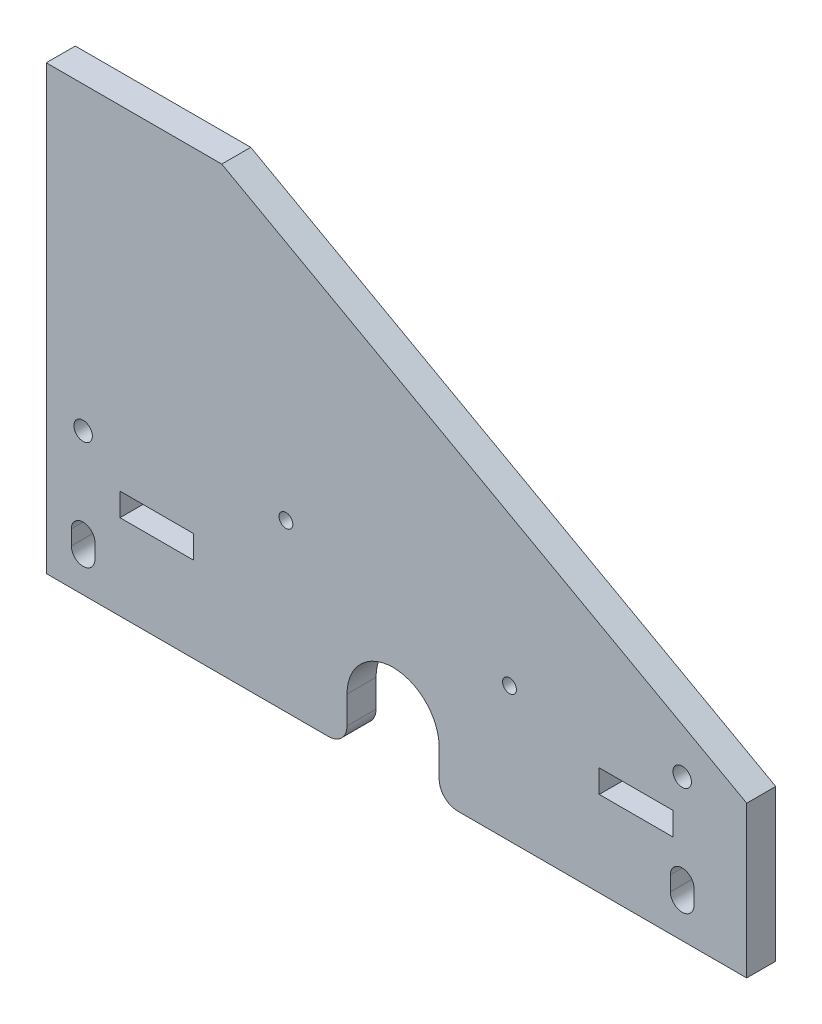
ISO-10303-21;
HEADER;
FILE_DESCRIPTION(('STEP AP214'),'2;1');
FILE_NAME('part.step','',(''),(''),'','','');
FILE_SCHEMA(('AUTOMOTIVE_DESIGN { 1 0 10303 214 1 1 1 1 }'));
ENDSEC;
DATA;
#1=APPLICATION_CONTEXT('core data for automotive mechanical design processes');
#2=APPLICATION_PROTOCOL_DEFINITION('international standard','automotive_design',2000,#1);
#3=PRODUCT_CONTEXT('',#1,'mechanical');
#4=PRODUCT('Part','Part','',(#3));
#5=PRODUCT_RELATED_PRODUCT_CATEGORY('part','',(#4));
#6=PRODUCT_DEFINITION_FORMATION('','',#4);
#7=PRODUCT_DEFINITION_CONTEXT('part definition',#1,'design');
#8=PRODUCT_DEFINITION('design','',#6,#7);
#9=PRODUCT_DEFINITION_SHAPE('','',#8);
#10=(LENGTH_UNIT() NAMED_UNIT(*) SI_UNIT(.MILLI.,.METRE.));
#11=(NAMED_UNIT(*) PLANE_ANGLE_UNIT() SI_UNIT($,.RADIAN.));
#12=(NAMED_UNIT(*) SI_UNIT($,.STERADIAN.) SOLID_ANGLE_UNIT());
#13=UNCERTAINTY_MEASURE_WITH_UNIT(LENGTH_MEASURE(1.E-05),#10,'distance_accuracy_value','');
#14=(GEOMETRIC_REPRESENTATION_CONTEXT(3) GLOBAL_UNCERTAINTY_ASSIGNED_CONTEXT((#13)) GLOBAL_UNIT_ASSIGNED_CONTEXT((#10,
#11,#12)) REPRESENTATION_CONTEXT('',''));
#15=CARTESIAN_POINT('',(0.,0.,0.));
#16=DIRECTION('',(0.,0.,1.));
#17=DIRECTION('',(1.,0.,0.));
#18=AXIS2_PLACEMENT_3D('',#15,#16,#17);
#19=CARTESIAN_POINT('',(-202.37863207058,-24.581916587002,10.));
#20=DIRECTION('',(0.,1.,0.));
#21=DIRECTION('',(0.,0.,1.));
#22=AXIS2_PLACEMENT_3D('',#19,#20,#21);
#23=PLANE('',#22);
#24=DIRECTION('',(0.,0.,1.));
#25=VECTOR('',#24,1.);
#26=CARTESIAN_POINT('',(-105.11949207058,-24.581916587002,0.));
#27=LINE('',#26,#25);
#28=CARTESIAN_POINT('',(-105.11949207058,-24.581916587002,0.));
#29=VERTEX_POINT('',#28);
#30=CARTESIAN_POINT('',(-105.11949207058,-24.581916587002,10.));
#31=VERTEX_POINT('',#30);
#32=EDGE_CURVE('E244',#29,#31,#27,.T.);
#33=ORIENTED_EDGE('',*,*,#32,.T.);
#34=DIRECTION('',(1.,0.,0.));
#35=VECTOR('',#34,1.);
#36=CARTESIAN_POINT('',(-202.37863207058,-24.581916587002,10.));
#37=LINE('',#36,#35);
#38=CARTESIAN_POINT('',(-202.37863207058,-24.581916587002,10.));
#39=VERTEX_POINT('',#38);
#40=EDGE_CURVE('E406',#39,#31,#37,.T.);
#41=ORIENTED_EDGE('',*,*,#40,.F.);
#42=DIRECTION('',(0.,0.,-1.));
#43=VECTOR('',#42,1.);
#44=CARTESIAN_POINT('',(-202.37863207058,-24.581916587002,10.));
#45=LINE('',#44,#43);
#46=CARTESIAN_POINT('',(-202.37863207058,-24.581916587002,0.));
#47=VERTEX_POINT('',#46);
#48=EDGE_CURVE('E423',#39,#47,#45,.T.);
#49=ORIENTED_EDGE('',*,*,#48,.T.);
#50=DIRECTION('',(1.,0.,0.));
#51=VECTOR('',#50,1.);
#52=CARTESIAN_POINT('',(-202.37863207058,-24.581916587002,0.));
#53=LINE('',#52,#51);
#54=EDGE_CURVE('E399',#47,#29,#53,.T.);
#55=ORIENTED_EDGE('',*,*,#54,.T.);
#56=EDGE_LOOP('',(#33,#41,#49,#55));
#57=FACE_BOUND('',#56,.T.);
#58=ADVANCED_FACE('F17',(#57),#23,.F.);
#59=CARTESIAN_POINT('',(38.92136792942,27.5724000758673,10.));
#60=DIRECTION('',(-1.,0.,0.));
#61=DIRECTION('',(0.,0.,1.));
#62=AXIS2_PLACEMENT_3D('',#59,#60,#61);
#63=PLANE('',#62);
#64=DIRECTION('',(0.,1.,0.));
#65=VECTOR('',#64,1.);
#66=CARTESIAN_POINT('',(38.92136792942,27.5724000758673,0.));
#67=LINE('',#66,#65);
#68=CARTESIAN_POINT('',(38.92136792942,-24.581916587002,0.));
#69=VERTEX_POINT('',#68);
#70=CARTESIAN_POINT('',(38.92136792942,27.5724000758673,0.));
#71=VERTEX_POINT('',#70);
#72=EDGE_CURVE('E394',#69,#71,#67,.T.);
#73=ORIENTED_EDGE('',*,*,#72,.T.);
#74=DIRECTION('',(0.,0.,-1.));
#75=VECTOR('',#74,1.);
#76=CARTESIAN_POINT('',(38.92136792942,27.5724000758673,10.));
#77=LINE('',#76,#75);
#78=CARTESIAN_POINT('',(38.92136792942,27.5724000758673,10.));
#79=VERTEX_POINT('',#78);
#80=EDGE_CURVE('E11',#79,#71,#77,.T.);
#81=ORIENTED_EDGE('',*,*,#80,.F.);
#82=DIRECTION('',(0.,1.,0.));
#83=VECTOR('',#82,1.);
#84=CARTESIAN_POINT('',(38.92136792942,27.5724000758673,10.));
#85=LINE('',#84,#83);
#86=CARTESIAN_POINT('',(38.92136792942,-24.581916587002,10.));
#87=VERTEX_POINT('',#86);
#88=EDGE_CURVE('E395',#87,#79,#85,.T.);
#89=ORIENTED_EDGE('',*,*,#88,.F.);
#90=DIRECTION('',(0.,0.,-1.));
#91=VECTOR('',#90,1.);
#92=CARTESIAN_POINT('',(38.92136792942,-24.581916587002,10.));
#93=LINE('',#92,#91);
#94=EDGE_CURVE('E409',#87,#69,#93,.T.);
#95=ORIENTED_EDGE('',*,*,#94,.T.);
#96=EDGE_LOOP('',(#73,#81,#89,#95));
#97=FACE_BOUND('',#96,.T.);
#98=ADVANCED_FACE('F19',(#97),#63,.F.);
#99=CARTESIAN_POINT('',(-141.92663207058,127.818083412998,10.));
#100=DIRECTION('',(-0.484809620246338,-0.874619707139395,0.));
#101=DIRECTION('',(0.874619707139395,-0.484809620246338,0.));
#102=AXIS2_PLACEMENT_3D('',#99,#100,#101);
#103=PLANE('',#102);
#104=DIRECTION('',(-0.874619707139395,0.484809620246338,0.));
#105=VECTOR('',#104,1.);
#106=CARTESIAN_POINT('',(-141.92663207058,127.818083412998,0.));
#107=LINE('',#106,#105);
#108=CARTESIAN_POINT('',(-141.92663207058,127.818083412998,0.));
#109=VERTEX_POINT('',#108);
#110=EDGE_CURVE('E412',#71,#109,#107,.T.);
#111=ORIENTED_EDGE('',*,*,#110,.T.);
#112=DIRECTION('',(0.,0.,-1.));
#113=VECTOR('',#112,1.);
#114=CARTESIAN_POINT('',(-141.92663207058,127.818083412998,10.));
#115=LINE('',#114,#113);
#116=CARTESIAN_POINT('',(-141.92663207058,127.818083412998,10.));
#117=VERTEX_POINT('',#116);
#118=EDGE_CURVE('E25',#117,#109,#115,.T.);
#119=ORIENTED_EDGE('',*,*,#118,.F.);
#120=DIRECTION('',(-0.874619707139395,0.484809620246338,0.));
#121=VECTOR('',#120,1.);
#122=CARTESIAN_POINT('',(-141.92663207058,127.818083412998,10.));
#123=LINE('',#122,#121);
#124=EDGE_CURVE('E398',#79,#117,#123,.T.);
#125=ORIENTED_EDGE('',*,*,#124,.F.);
#126=ORIENTED_EDGE('',*,*,#80,.T.);
#127=EDGE_LOOP('',(#111,#119,#125,#126));
#128=FACE_BOUND('',#127,.T.);
#129=ADVANCED_FACE('F452',(#128),#103,.F.);
#130=CARTESIAN_POINT('',(-202.37863207058,127.818083412998,10.));
#131=DIRECTION('',(0.,-1.,0.));
#132=DIRECTION('',(0.,0.,-1.));
#133=AXIS2_PLACEMENT_3D('',#130,#131,#132);
#134=PLANE('',#133);
#135=DIRECTION('',(-1.,0.,0.));
#136=VECTOR('',#135,1.);
#137=CARTESIAN_POINT('',(-202.37863207058,127.818083412998,0.));
#138=LINE('',#137,#136);
#139=CARTESIAN_POINT('',(-202.37863207058,127.818083412998,0.));
#140=VERTEX_POINT('',#139);
#141=EDGE_CURVE('E414',#109,#140,#138,.T.);
#142=ORIENTED_EDGE('',*,*,#141,.T.);
#143=DIRECTION('',(0.,0.,-1.));
#144=VECTOR('',#143,1.);
#145=CARTESIAN_POINT('',(-202.37863207058,127.818083412998,10.));
#146=LINE('',#145,#144);
#147=CARTESIAN_POINT('',(-202.37863207058,127.818083412998,10.));
#148=VERTEX_POINT('',#147);
#149=EDGE_CURVE('E426',#148,#140,#146,.T.);
#150=ORIENTED_EDGE('',*,*,#149,.F.);
#151=DIRECTION('',(-1.,0.,0.));
#152=VECTOR('',#151,1.);
#153=CARTESIAN_POINT('',(-202.37863207058,127.818083412998,10.));
#154=LINE('',#153,#152);
#155=EDGE_CURVE('E401',#117,#148,#154,.T.);
#156=ORIENTED_EDGE('',*,*,#155,.F.);
#157=ORIENTED_EDGE('',*,*,#118,.T.);
#158=EDGE_LOOP('',(#142,#150,#156,#157));
#159=FACE_BOUND('',#158,.T.);
#160=ADVANCED_FACE('F433',(#159),#134,.F.);
#161=CARTESIAN_POINT('',(-202.37863207058,127.818083412998,10.));
#162=DIRECTION('',(1.,0.,0.));
#163=DIRECTION('',(0.,1.,0.));
#164=AXIS2_PLACEMENT_3D('',#161,#162,#163);
#165=PLANE('',#164);
#166=DIRECTION('',(0.,-1.,0.));
#167=VECTOR('',#166,1.);
#168=CARTESIAN_POINT('',(-202.37863207058,127.818083412998,0.));
#169=LINE('',#168,#167);
#170=EDGE_CURVE('E416',#140,#47,#169,.T.);
#171=ORIENTED_EDGE('',*,*,#170,.T.);
#172=ORIENTED_EDGE('',*,*,#48,.F.);
#173=DIRECTION('',(0.,-1.,0.));
#174=VECTOR('',#173,1.);
#175=CARTESIAN_POINT('',(-202.37863207058,127.818083412998,10.));
#176=LINE('',#175,#174);
#177=EDGE_CURVE('E403',#148,#39,#176,.T.);
#178=ORIENTED_EDGE('',*,*,#177,.F.);
#179=ORIENTED_EDGE('',*,*,#149,.T.);
#180=EDGE_LOOP('',(#171,#172,#178,#179));
#181=FACE_BOUND('',#180,.T.);
#182=ADVANCED_FACE('F441',(#181),#165,.F.);
#183=CARTESIAN_POINT('',(-60.6694920705801,-24.581916587002,10.));
#184=VERTEX_POINT('',#183);
#185=EDGE_CURVE('E405',#184,#87,#37,.T.);
#186=ORIENTED_EDGE('',*,*,#185,.F.);
#187=DIRECTION('',(0.,0.,1.));
#188=VECTOR('',#187,1.);
#189=CARTESIAN_POINT('',(-60.6694920705801,-24.581916587002,0.));
#190=LINE('',#189,#188);
#191=CARTESIAN_POINT('',(-60.6694920705801,-24.581916587002,0.));
#192=VERTEX_POINT('',#191);
#193=EDGE_CURVE('E242',#192,#184,#190,.T.);
#194=ORIENTED_EDGE('',*,*,#193,.F.);
#195=EDGE_CURVE('E418',#192,#69,#53,.T.);
#196=ORIENTED_EDGE('',*,*,#195,.T.);
#197=ORIENTED_EDGE('',*,*,#94,.F.);
#198=EDGE_LOOP('',(#186,#194,#196,#197));
#199=FACE_BOUND('',#198,.T.);
#200=ADVANCED_FACE('F458',(#199),#23,.F.);
#201=CARTESIAN_POINT('',(38.9213679294199,-24.581916587002,10.));
#202=DIRECTION('',(0.,0.,1.));
#203=DIRECTION('',(1.,0.,0.));
#204=AXIS2_PLACEMENT_3D('',#201,#202,#203);
#205=PLANE('',#204);
#206=CARTESIAN_POINT('',(-60.6694920705801,-18.231916587002,10.));
#207=DIRECTION('',(0.,0.,-1.));
#208=DIRECTION('',(1.,0.,0.));
#209=AXIS2_PLACEMENT_3D('',#206,#207,#208);
#210=CIRCLE('',#209,6.35);
#211=CARTESIAN_POINT('',(-67.0194920705801,-18.231916587002,10.));
#212=VERTEX_POINT('',#211);
#213=EDGE_CURVE('E223',#184,#212,#210,.T.);
#214=ORIENTED_EDGE('',*,*,#213,.F.);
#215=ORIENTED_EDGE('',*,*,#185,.T.);
#216=ORIENTED_EDGE('',*,*,#88,.T.);
#217=ORIENTED_EDGE('',*,*,#124,.T.);
#218=ORIENTED_EDGE('',*,*,#155,.T.);
#219=ORIENTED_EDGE('',*,*,#177,.T.);
#220=ORIENTED_EDGE('',*,*,#40,.T.);
#221=CARTESIAN_POINT('',(-105.11949207058,-18.231916587002,10.));
#222=DIRECTION('',(0.,0.,-1.));
#223=DIRECTION('',(1.,0.,0.));
#224=AXIS2_PLACEMENT_3D('',#221,#222,#223);
#225=CIRCLE('',#224,6.35);
#226=CARTESIAN_POINT('',(-98.7694920705801,-18.231916587002,10.));
#227=VERTEX_POINT('',#226);
#228=EDGE_CURVE('E233',#227,#31,#225,.T.);
#229=ORIENTED_EDGE('',*,*,#228,.F.);
#230=DIRECTION('',(0.,-1.,0.));
#231=VECTOR('',#230,1.);
#232=CARTESIAN_POINT('',(-98.7694920705801,-8.70691658700201,10.));
#233=LINE('',#232,#231);
#234=CARTESIAN_POINT('',(-98.7694920705801,-8.70691658700201,10.));
#235=VERTEX_POINT('',#234);
#236=EDGE_CURVE('E231',#235,#227,#233,.T.);
#237=ORIENTED_EDGE('',*,*,#236,.F.);
#238=CARTESIAN_POINT('',(-82.8944920705801,-8.70691658700201,10.));
#239=DIRECTION('',(0.,0.,1.));
#240=DIRECTION('',(1.,0.,0.));
#241=AXIS2_PLACEMENT_3D('',#238,#239,#240);
#242=CIRCLE('',#241,15.875);
#243=CARTESIAN_POINT('',(-67.0194920705801,-8.70691658700201,10.));
#244=VERTEX_POINT('',#243);
#245=EDGE_CURVE('E203',#244,#235,#242,.T.);
#246=ORIENTED_EDGE('',*,*,#245,.F.);
#247=DIRECTION('',(0.,1.,0.));
#248=VECTOR('',#247,1.);
#249=CARTESIAN_POINT('',(-67.0194920705801,-8.70691658700201,10.));
#250=LINE('',#249,#248);
#251=EDGE_CURVE('E220',#212,#244,#250,.T.);
#252=ORIENTED_EDGE('',*,*,#251,.F.);
#253=EDGE_LOOP('',(#214,#215,#216,#217,#218,#219,#220,#229,#237,#246,#252));
#254=FACE_BOUND('',#253,.T.);
#255=CARTESIAN_POINT('',(16.6963679294199,24.358803412998,10.));
#256=DIRECTION('',(0.,0.,1.));
#257=DIRECTION('',(1.,0.,0.));
#258=AXIS2_PLACEMENT_3D('',#255,#256,#257);
#259=CIRCLE('',#258,3.175);
#260=CARTESIAN_POINT('',(19.8713679294199,24.358803412998,10.));
#261=VERTEX_POINT('',#260);
#262=EDGE_CURVE('E239',#261,#261,#259,.T.);
#263=ORIENTED_EDGE('',*,*,#262,.F.);
#264=EDGE_LOOP('',(#263));
#265=FACE_BOUND('',#264,.T.);
#266=CARTESIAN_POINT('',(16.6963679294199,-12.008916587002,10.));
#267=DIRECTION('',(0.,0.,1.));
#268=DIRECTION('',(1.,0.,0.));
#269=AXIS2_PLACEMENT_3D('',#266,#267,#268);
#270=CIRCLE('',#269,4.064);
#271=CARTESIAN_POINT('',(12.6323679294199,-12.008916587002,10.));
#272=VERTEX_POINT('',#271);
#273=CARTESIAN_POINT('',(20.76036792942,-12.008916587002,10.));
#274=VERTEX_POINT('',#273);
#275=EDGE_CURVE('E40',#272,#274,#270,.T.);
#276=ORIENTED_EDGE('',*,*,#275,.F.);
#277=DIRECTION('',(0.,-1.,0.));
#278=VECTOR('',#277,1.);
#279=CARTESIAN_POINT('',(12.6323679294199,-12.008916587002,10.));
#280=LINE('',#279,#278);
#281=CARTESIAN_POINT('',(12.6323679294199,-6.92891658700202,10.));
#282=VERTEX_POINT('',#281);
#283=EDGE_CURVE('E268',#282,#272,#280,.T.);
#284=ORIENTED_EDGE('',*,*,#283,.F.);
#285=CARTESIAN_POINT('',(16.6963679294199,-6.92891658700202,10.));
#286=DIRECTION('',(0.,0.,1.));
#287=DIRECTION('',(1.,0.,0.));
#288=AXIS2_PLACEMENT_3D('',#285,#286,#287);
#289=CIRCLE('',#288,4.064);
#290=CARTESIAN_POINT('',(20.76036792942,-6.92891658700202,10.));
#291=VERTEX_POINT('',#290);
#292=EDGE_CURVE('E265',#291,#282,#289,.T.);
#293=ORIENTED_EDGE('',*,*,#292,.F.);
#294=DIRECTION('',(0.,1.,0.));
#295=VECTOR('',#294,1.);
#296=CARTESIAN_POINT('',(20.76036792942,-6.92891658700202,10.));
#297=LINE('',#296,#295);
#298=EDGE_CURVE('E262',#274,#291,#297,.T.);
#299=ORIENTED_EDGE('',*,*,#298,.F.);
#300=EDGE_LOOP('',(#276,#284,#293,#299));
#301=FACE_BOUND('',#300,.T.);
#302=DIRECTION('',(0.,1.,0.));
#303=VECTOR('',#302,1.);
#304=CARTESIAN_POINT('',(13.5213679294199,12.725603412998,10.));
#305=LINE('',#304,#303);
#306=CARTESIAN_POINT('',(13.5213679294199,4.78810341299798,10.));
#307=VERTEX_POINT('',#306);
#308=CARTESIAN_POINT('',(13.5213679294199,12.725603412998,10.));
#309=VERTEX_POINT('',#308);
#310=EDGE_CURVE('E282',#307,#309,#305,.T.);
#311=ORIENTED_EDGE('',*,*,#310,.F.);
#312=DIRECTION('',(1.,0.,0.));
#313=VECTOR('',#312,1.);
#314=CARTESIAN_POINT('',(13.5213679294199,4.78810341299798,10.));
#315=LINE('',#314,#313);
#316=CARTESIAN_POINT('',(-11.87863207058,4.78810341299798,10.));
#317=VERTEX_POINT('',#316);
#318=EDGE_CURVE('E287',#317,#307,#315,.T.);
#319=ORIENTED_EDGE('',*,*,#318,.F.);
#320=DIRECTION('',(0.,-1.,0.));
#321=VECTOR('',#320,1.);
#322=CARTESIAN_POINT('',(-11.87863207058,12.725603412998,10.));
#323=LINE('',#322,#321);
#324=CARTESIAN_POINT('',(-11.87863207058,12.725603412998,10.));
#325=VERTEX_POINT('',#324);
#326=EDGE_CURVE('E301',#325,#317,#323,.T.);
#327=ORIENTED_EDGE('',*,*,#326,.F.);
#328=DIRECTION('',(-1.,0.,0.));
#329=VECTOR('',#328,1.);
#330=CARTESIAN_POINT('',(13.5213679294199,12.725603412998,10.));
#331=LINE('',#330,#329);
#332=EDGE_CURVE('E298',#309,#325,#331,.T.);
#333=ORIENTED_EDGE('',*,*,#332,.F.);
#334=EDGE_LOOP('',(#311,#319,#327,#333));
#335=FACE_BOUND('',#334,.T.);
#336=CARTESIAN_POINT('',(-42.7929720705801,21.773083412998,10.));
#337=DIRECTION('',(0.,0.,1.));
#338=DIRECTION('',(1.,0.,0.));
#339=AXIS2_PLACEMENT_3D('',#336,#337,#338);
#340=CIRCLE('',#339,2.38125);
#341=CARTESIAN_POINT('',(-40.4117220705801,21.773083412998,10.));
#342=VERTEX_POINT('',#341);
#343=EDGE_CURVE('E308',#342,#342,#340,.T.);
#344=ORIENTED_EDGE('',*,*,#343,.F.);
#345=EDGE_LOOP('',(#344));
#346=FACE_BOUND('',#345,.T.);
#347=CARTESIAN_POINT('',(-119.82863207058,32.568083412998,10.));
#348=DIRECTION('',(0.,0.,1.));
#349=DIRECTION('',(1.,0.,0.));
#350=AXIS2_PLACEMENT_3D('',#347,#348,#349);
#351=CIRCLE('',#350,2.38125);
#352=CARTESIAN_POINT('',(-117.44738207058,32.568083412998,10.));
#353=VERTEX_POINT('',#352);
#354=EDGE_CURVE('E318',#353,#353,#351,.T.);
#355=ORIENTED_EDGE('',*,*,#354,.F.);
#356=EDGE_LOOP('',(#355));
#357=FACE_BOUND('',#356,.T.);
#358=CARTESIAN_POINT('',(-189.67863207058,24.358803412998,10.));
#359=DIRECTION('',(0.,0.,1.));
#360=DIRECTION('',(1.,0.,0.));
#361=AXIS2_PLACEMENT_3D('',#358,#359,#360);
#362=CIRCLE('',#361,3.175);
#363=CARTESIAN_POINT('',(-186.50363207058,24.358803412998,10.));
#364=VERTEX_POINT('',#363);
#365=EDGE_CURVE('E324',#364,#364,#362,.T.);
#366=ORIENTED_EDGE('',*,*,#365,.F.);
#367=EDGE_LOOP('',(#366));
#368=FACE_BOUND('',#367,.T.);
#369=CARTESIAN_POINT('',(-189.67863207058,-12.008916587002,10.));
#370=DIRECTION('',(0.,0.,1.));
#371=DIRECTION('',(1.,0.,0.));
#372=AXIS2_PLACEMENT_3D('',#369,#370,#371);
#373=CIRCLE('',#372,4.064);
#374=CARTESIAN_POINT('',(-193.74263207058,-12.008916587002,10.));
#375=VERTEX_POINT('',#374);
#376=CARTESIAN_POINT('',(-185.61463207058,-12.008916587002,10.));
#377=VERTEX_POINT('',#376);
#378=EDGE_CURVE('E340',#375,#377,#373,.T.);
#379=ORIENTED_EDGE('',*,*,#378,.F.);
#380=DIRECTION('',(0.,-1.,0.));
#381=VECTOR('',#380,1.);
#382=CARTESIAN_POINT('',(-193.74263207058,-12.008916587002,10.));
#383=LINE('',#382,#381);
#384=CARTESIAN_POINT('',(-193.74263207058,-6.92891658700202,10.));
#385=VERTEX_POINT('',#384);
#386=EDGE_CURVE('E348',#385,#375,#383,.T.);
#387=ORIENTED_EDGE('',*,*,#386,.F.);
#388=CARTESIAN_POINT('',(-189.67863207058,-6.92891658700202,10.));
#389=DIRECTION('',(0.,0.,1.));
#390=DIRECTION('',(1.,0.,0.));
#391=AXIS2_PLACEMENT_3D('',#388,#389,#390);
#392=CIRCLE('',#391,4.064);
#393=CARTESIAN_POINT('',(-185.61463207058,-6.92891658700202,10.));
#394=VERTEX_POINT('',#393);
#395=EDGE_CURVE('E345',#394,#385,#392,.T.);
#396=ORIENTED_EDGE('',*,*,#395,.F.);
#397=DIRECTION('',(0.,1.,0.));
#398=VECTOR('',#397,1.);
#399=CARTESIAN_POINT('',(-185.61463207058,-6.92891658700202,10.));
#400=LINE('',#399,#398);
#401=EDGE_CURVE('E342',#377,#394,#400,.T.);
#402=ORIENTED_EDGE('',*,*,#401,.F.);
#403=EDGE_LOOP('',(#379,#387,#396,#402));
#404=FACE_BOUND('',#403,.T.);
#405=DIRECTION('',(0.,-1.,0.));
#406=VECTOR('',#405,1.);
#407=CARTESIAN_POINT('',(-176.97863207058,4.78810341299798,10.));
#408=LINE('',#407,#406);
#409=CARTESIAN_POINT('',(-176.97863207058,12.725603412998,10.));
#410=VERTEX_POINT('',#409);
#411=CARTESIAN_POINT('',(-176.97863207058,4.78810341299798,10.));
#412=VERTEX_POINT('',#411);
#413=EDGE_CURVE('E371',#410,#412,#408,.T.);
#414=ORIENTED_EDGE('',*,*,#413,.F.);
#415=DIRECTION('',(-1.,0.,0.));
#416=VECTOR('',#415,1.);
#417=CARTESIAN_POINT('',(-176.97863207058,12.725603412998,10.));
#418=LINE('',#417,#416);
#419=CARTESIAN_POINT('',(-151.57863207058,12.725603412998,10.));
#420=VERTEX_POINT('',#419);
#421=EDGE_CURVE('E379',#420,#410,#418,.T.);
#422=ORIENTED_EDGE('',*,*,#421,.F.);
#423=DIRECTION('',(0.,1.,0.));
#424=VECTOR('',#423,1.);
#425=CARTESIAN_POINT('',(-151.57863207058,4.78810341299798,10.));
#426=LINE('',#425,#424);
#427=CARTESIAN_POINT('',(-151.57863207058,4.78810341299798,10.));
#428=VERTEX_POINT('',#427);
#429=EDGE_CURVE('E376',#428,#420,#426,.T.);
#430=ORIENTED_EDGE('',*,*,#429,.F.);
#431=DIRECTION('',(1.,0.,0.));
#432=VECTOR('',#431,1.);
#433=CARTESIAN_POINT('',(-176.97863207058,4.78810341299798,10.));
#434=LINE('',#433,#432);
#435=EDGE_CURVE('E373',#412,#428,#434,.T.);
#436=ORIENTED_EDGE('',*,*,#435,.F.);
#437=EDGE_LOOP('',(#414,#422,#430,#436));
#438=FACE_BOUND('',#437,.T.);
#439=ADVANCED_FACE('F448',(#254,#265,#301,#335,#346,#357,#368,#404,#438),#205,.T.);
#440=CARTESIAN_POINT('',(38.9213679294199,-24.581916587002,0.));
#441=DIRECTION('',(0.,0.,1.));
#442=DIRECTION('',(1.,0.,0.));
#443=AXIS2_PLACEMENT_3D('',#440,#441,#442);
#444=PLANE('',#443);
#445=ORIENTED_EDGE('',*,*,#195,.F.);
#446=CARTESIAN_POINT('',(-60.6694920705801,-18.231916587002,0.));
#447=DIRECTION('',(0.,0.,-1.));
#448=DIRECTION('',(1.,0.,0.));
#449=AXIS2_PLACEMENT_3D('',#446,#447,#448);
#450=CIRCLE('',#449,6.35);
#451=CARTESIAN_POINT('',(-67.0194920705801,-18.231916587002,0.));
#452=VERTEX_POINT('',#451);
#453=EDGE_CURVE('E227',#192,#452,#450,.T.);
#454=ORIENTED_EDGE('',*,*,#453,.T.);
#455=DIRECTION('',(0.,1.,0.));
#456=VECTOR('',#455,1.);
#457=CARTESIAN_POINT('',(-67.0194920705801,-8.70691658700201,0.));
#458=LINE('',#457,#456);
#459=CARTESIAN_POINT('',(-67.0194920705801,-8.70691658700201,0.));
#460=VERTEX_POINT('',#459);
#461=EDGE_CURVE('E208',#452,#460,#458,.T.);
#462=ORIENTED_EDGE('',*,*,#461,.T.);
#463=CARTESIAN_POINT('',(-82.8944920705801,-8.70691658700201,0.));
#464=DIRECTION('',(0.,0.,1.));
#465=DIRECTION('',(1.,0.,0.));
#466=AXIS2_PLACEMENT_3D('',#463,#464,#465);
#467=CIRCLE('',#466,15.875);
#468=CARTESIAN_POINT('',(-98.7694920705801,-8.70691658700201,0.));
#469=VERTEX_POINT('',#468);
#470=EDGE_CURVE('E200',#460,#469,#467,.T.);
#471=ORIENTED_EDGE('',*,*,#470,.T.);
#472=DIRECTION('',(0.,-1.,0.));
#473=VECTOR('',#472,1.);
#474=CARTESIAN_POINT('',(-98.7694920705801,-8.70691658700201,0.));
#475=LINE('',#474,#473);
#476=CARTESIAN_POINT('',(-98.7694920705801,-18.231916587002,0.));
#477=VERTEX_POINT('',#476);
#478=EDGE_CURVE('E211',#469,#477,#475,.T.);
#479=ORIENTED_EDGE('',*,*,#478,.T.);
#480=CARTESIAN_POINT('',(-105.11949207058,-18.231916587002,0.));
#481=DIRECTION('',(0.,0.,-1.));
#482=DIRECTION('',(1.,0.,0.));
#483=AXIS2_PLACEMENT_3D('',#480,#481,#482);
#484=CIRCLE('',#483,6.35);
#485=EDGE_CURVE('E32',#477,#29,#484,.T.);
#486=ORIENTED_EDGE('',*,*,#485,.T.);
#487=ORIENTED_EDGE('',*,*,#54,.F.);
#488=ORIENTED_EDGE('',*,*,#170,.F.);
#489=ORIENTED_EDGE('',*,*,#141,.F.);
#490=ORIENTED_EDGE('',*,*,#110,.F.);
#491=ORIENTED_EDGE('',*,*,#72,.F.);
#492=EDGE_LOOP('',(#445,#454,#462,#471,#479,#486,#487,#488,#489,#490,#491));
#493=FACE_BOUND('',#492,.T.);
#494=CARTESIAN_POINT('',(16.6963679294199,24.358803412998,0.));
#495=DIRECTION('',(0.,0.,1.));
#496=DIRECTION('',(1.,0.,0.));
#497=AXIS2_PLACEMENT_3D('',#494,#495,#496);
#498=CIRCLE('',#497,3.175);
#499=CARTESIAN_POINT('',(19.8713679294199,24.358803412998,0.));
#500=VERTEX_POINT('',#499);
#501=EDGE_CURVE('E248',#500,#500,#498,.T.);
#502=ORIENTED_EDGE('',*,*,#501,.T.);
#503=EDGE_LOOP('',(#502));
#504=FACE_BOUND('',#503,.T.);
#505=DIRECTION('',(0.,1.,0.));
#506=VECTOR('',#505,1.);
#507=CARTESIAN_POINT('',(12.6323679294199,-12.008916587002,0.));
#508=LINE('',#507,#506);
#509=CARTESIAN_POINT('',(12.6323679294199,-12.008916587002,0.));
#510=VERTEX_POINT('',#509);
#511=CARTESIAN_POINT('',(12.6323679294199,-6.92891658700202,0.));
#512=VERTEX_POINT('',#511);
#513=EDGE_CURVE('E255',#510,#512,#508,.T.);
#514=ORIENTED_EDGE('',*,*,#513,.F.);
#515=CARTESIAN_POINT('',(16.6963679294199,-12.008916587002,0.));
#516=DIRECTION('',(0.,0.,1.));
#517=DIRECTION('',(1.,0.,0.));
#518=AXIS2_PLACEMENT_3D('',#515,#516,#517);
#519=CIRCLE('',#518,4.064);
#520=CARTESIAN_POINT('',(20.76036792942,-12.008916587002,0.));
#521=VERTEX_POINT('',#520);
#522=EDGE_CURVE('E258',#521,#510,#519,.F.);
#523=ORIENTED_EDGE('',*,*,#522,.F.);
#524=DIRECTION('',(0.,-1.,0.));
#525=VECTOR('',#524,1.);
#526=CARTESIAN_POINT('',(20.76036792942,-6.92891658700202,0.));
#527=LINE('',#526,#525);
#528=CARTESIAN_POINT('',(20.76036792942,-6.92891658700202,0.));
#529=VERTEX_POINT('',#528);
#530=EDGE_CURVE('E274',#529,#521,#527,.T.);
#531=ORIENTED_EDGE('',*,*,#530,.F.);
#532=CARTESIAN_POINT('',(16.6963679294199,-6.92891658700202,0.));
#533=DIRECTION('',(0.,0.,1.));
#534=DIRECTION('',(1.,0.,0.));
#535=AXIS2_PLACEMENT_3D('',#532,#533,#534);
#536=CIRCLE('',#535,4.064);
#537=EDGE_CURVE('E251',#512,#529,#536,.F.);
#538=ORIENTED_EDGE('',*,*,#537,.F.);
#539=EDGE_LOOP('',(#514,#523,#531,#538));
#540=FACE_BOUND('',#539,.T.);
#541=DIRECTION('',(1.,0.,0.));
#542=VECTOR('',#541,1.);
#543=CARTESIAN_POINT('',(13.5213679294199,4.78810341299798,0.));
#544=LINE('',#543,#542);
#545=CARTESIAN_POINT('',(-11.87863207058,4.78810341299798,0.));
#546=VERTEX_POINT('',#545);
#547=CARTESIAN_POINT('',(13.5213679294199,4.78810341299798,0.));
#548=VERTEX_POINT('',#547);
#549=EDGE_CURVE('E293',#546,#548,#544,.T.);
#550=ORIENTED_EDGE('',*,*,#549,.T.);
#551=DIRECTION('',(0.,1.,0.));
#552=VECTOR('',#551,1.);
#553=CARTESIAN_POINT('',(13.5213679294199,12.725603412998,0.));
#554=LINE('',#553,#552);
#555=CARTESIAN_POINT('',(13.5213679294199,12.725603412998,0.));
#556=VERTEX_POINT('',#555);
#557=EDGE_CURVE('E283',#548,#556,#554,.T.);
#558=ORIENTED_EDGE('',*,*,#557,.T.);
#559=DIRECTION('',(-1.,0.,0.));
#560=VECTOR('',#559,1.);
#561=CARTESIAN_POINT('',(13.5213679294199,12.725603412998,0.));
#562=LINE('',#561,#560);
#563=CARTESIAN_POINT('',(-11.87863207058,12.725603412998,0.));
#564=VERTEX_POINT('',#563);
#565=EDGE_CURVE('E286',#556,#564,#562,.T.);
#566=ORIENTED_EDGE('',*,*,#565,.T.);
#567=DIRECTION('',(0.,-1.,0.));
#568=VECTOR('',#567,1.);
#569=CARTESIAN_POINT('',(-11.87863207058,12.725603412998,0.));
#570=LINE('',#569,#568);
#571=EDGE_CURVE('E290',#564,#546,#570,.T.);
#572=ORIENTED_EDGE('',*,*,#571,.T.);
#573=EDGE_LOOP('',(#550,#558,#566,#572));
#574=FACE_BOUND('',#573,.T.);
#575=CARTESIAN_POINT('',(-42.7929720705801,21.773083412998,0.));
#576=DIRECTION('',(0.,0.,1.));
#577=DIRECTION('',(1.,0.,0.));
#578=AXIS2_PLACEMENT_3D('',#575,#576,#577);
#579=CIRCLE('',#578,2.38125);
#580=CARTESIAN_POINT('',(-40.4117220705801,21.773083412998,0.));
#581=VERTEX_POINT('',#580);
#582=EDGE_CURVE('E315',#581,#581,#579,.T.);
#583=ORIENTED_EDGE('',*,*,#582,.T.);
#584=EDGE_LOOP('',(#583));
#585=FACE_BOUND('',#584,.T.);
#586=CARTESIAN_POINT('',(-119.82863207058,32.568083412998,0.));
#587=DIRECTION('',(0.,0.,1.));
#588=DIRECTION('',(1.,0.,0.));
#589=AXIS2_PLACEMENT_3D('',#586,#587,#588);
#590=CIRCLE('',#589,2.38125);
#591=CARTESIAN_POINT('',(-117.44738207058,32.568083412998,0.));
#592=VERTEX_POINT('',#591);
#593=EDGE_CURVE('E321',#592,#592,#590,.T.);
#594=ORIENTED_EDGE('',*,*,#593,.T.);
#595=EDGE_LOOP('',(#594));
#596=FACE_BOUND('',#595,.T.);
#597=CARTESIAN_POINT('',(-189.67863207058,24.358803412998,0.));
#598=DIRECTION('',(0.,0.,1.));
#599=DIRECTION('',(1.,0.,0.));
#600=AXIS2_PLACEMENT_3D('',#597,#598,#599);
#601=CIRCLE('',#600,3.175);
#602=CARTESIAN_POINT('',(-186.50363207058,24.358803412998,0.));
#603=VERTEX_POINT('',#602);
#604=EDGE_CURVE('E327',#603,#603,#601,.T.);
#605=ORIENTED_EDGE('',*,*,#604,.T.);
#606=EDGE_LOOP('',(#605));
#607=FACE_BOUND('',#606,.T.);
#608=DIRECTION('',(0.,1.,0.));
#609=VECTOR('',#608,1.);
#610=CARTESIAN_POINT('',(-193.74263207058,-12.008916587002,0.));
#611=LINE('',#610,#609);
#612=CARTESIAN_POINT('',(-193.74263207058,-12.008916587002,0.));
#613=VERTEX_POINT('',#612);
#614=CARTESIAN_POINT('',(-193.74263207058,-6.92891658700202,0.));
#615=VERTEX_POINT('',#614);
#616=EDGE_CURVE('E334',#613,#615,#611,.T.);
#617=ORIENTED_EDGE('',*,*,#616,.F.);
#618=CARTESIAN_POINT('',(-189.67863207058,-12.008916587002,0.));
#619=DIRECTION('',(0.,0.,1.));
#620=DIRECTION('',(1.,0.,0.));
#621=AXIS2_PLACEMENT_3D('',#618,#619,#620);
#622=CIRCLE('',#621,4.064);
#623=CARTESIAN_POINT('',(-185.61463207058,-12.008916587002,0.));
#624=VERTEX_POINT('',#623);
#625=EDGE_CURVE('E337',#624,#613,#622,.F.);
#626=ORIENTED_EDGE('',*,*,#625,.F.);
#627=DIRECTION('',(0.,-1.,0.));
#628=VECTOR('',#627,1.);
#629=CARTESIAN_POINT('',(-185.61463207058,-6.92891658700202,0.));
#630=LINE('',#629,#628);
#631=CARTESIAN_POINT('',(-185.61463207058,-6.92891658700202,0.));
#632=VERTEX_POINT('',#631);
#633=EDGE_CURVE('E354',#632,#624,#630,.T.);
#634=ORIENTED_EDGE('',*,*,#633,.F.);
#635=CARTESIAN_POINT('',(-189.67863207058,-6.92891658700202,0.));
#636=DIRECTION('',(0.,0.,1.));
#637=DIRECTION('',(1.,0.,0.));
#638=AXIS2_PLACEMENT_3D('',#635,#636,#637);
#639=CIRCLE('',#638,4.064);
#640=EDGE_CURVE('E330',#615,#632,#639,.F.);
#641=ORIENTED_EDGE('',*,*,#640,.F.);
#642=EDGE_LOOP('',(#617,#626,#634,#641));
#643=FACE_BOUND('',#642,.T.);
#644=DIRECTION('',(1.,0.,0.));
#645=VECTOR('',#644,1.);
#646=CARTESIAN_POINT('',(-176.97863207058,12.725603412998,0.));
#647=LINE('',#646,#645);
#648=CARTESIAN_POINT('',(-176.97863207058,12.725603412998,0.));
#649=VERTEX_POINT('',#648);
#650=CARTESIAN_POINT('',(-151.57863207058,12.725603412998,0.));
#651=VERTEX_POINT('',#650);
#652=EDGE_CURVE('E365',#649,#651,#647,.T.);
#653=ORIENTED_EDGE('',*,*,#652,.F.);
#654=DIRECTION('',(0.,1.,0.));
#655=VECTOR('',#654,1.);
#656=CARTESIAN_POINT('',(-176.97863207058,4.78810341299798,0.));
#657=LINE('',#656,#655);
#658=CARTESIAN_POINT('',(-176.97863207058,4.78810341299798,0.));
#659=VERTEX_POINT('',#658);
#660=EDGE_CURVE('E368',#659,#649,#657,.T.);
#661=ORIENTED_EDGE('',*,*,#660,.F.);
#662=DIRECTION('',(-1.,0.,0.));
#663=VECTOR('',#662,1.);
#664=CARTESIAN_POINT('',(-176.97863207058,4.78810341299798,0.));
#665=LINE('',#664,#663);
#666=CARTESIAN_POINT('',(-151.57863207058,4.78810341299798,0.));
#667=VERTEX_POINT('',#666);
#668=EDGE_CURVE('E385',#667,#659,#665,.T.);
#669=ORIENTED_EDGE('',*,*,#668,.F.);
#670=DIRECTION('',(0.,-1.,0.));
#671=VECTOR('',#670,1.);
#672=CARTESIAN_POINT('',(-151.57863207058,4.78810341299798,0.));
#673=LINE('',#672,#671);
#674=EDGE_CURVE('E363',#651,#667,#673,.T.);
#675=ORIENTED_EDGE('',*,*,#674,.F.);
#676=EDGE_LOOP('',(#653,#661,#669,#675));
#677=FACE_BOUND('',#676,.T.);
#678=ADVANCED_FACE('F216',(#493,#504,#540,#574,#585,#596,#607,#643,#677),#444,.F.);
#679=CARTESIAN_POINT('',(-176.97863207058,4.78810341299798,-0.000999999999999265));
#680=DIRECTION('',(-1.,0.,0.));
#681=DIRECTION('',(0.,0.,1.));
#682=AXIS2_PLACEMENT_3D('',#679,#680,#681);
#683=PLANE('',#682);
#684=ORIENTED_EDGE('',*,*,#660,.T.);
#685=DIRECTION('',(0.,0.,1.));
#686=VECTOR('',#685,1.);
#687=CARTESIAN_POINT('',(-176.97863207058,12.725603412998,-0.000999999999999265));
#688=LINE('',#687,#686);
#689=EDGE_CURVE('E383',#649,#410,#688,.T.);
#690=ORIENTED_EDGE('',*,*,#689,.T.);
#691=ORIENTED_EDGE('',*,*,#413,.T.);
#692=DIRECTION('',(0.,0.,1.));
#693=VECTOR('',#692,1.);
#694=CARTESIAN_POINT('',(-176.97863207058,4.78810341299798,-0.000999999999999265));
#695=LINE('',#694,#693);
#696=EDGE_CURVE('E382',#659,#412,#695,.T.);
#697=ORIENTED_EDGE('',*,*,#696,.F.);
#698=EDGE_LOOP('',(#684,#690,#691,#697));
#699=FACE_BOUND('',#698,.T.);
#700=ADVANCED_FACE('F534',(#699),#683,.F.);
#701=CARTESIAN_POINT('',(-176.97863207058,12.725603412998,-0.000999999999999265));
#702=DIRECTION('',(0.,1.,0.));
#703=DIRECTION('',(0.,0.,1.));
#704=AXIS2_PLACEMENT_3D('',#701,#702,#703);
#705=PLANE('',#704);
#706=ORIENTED_EDGE('',*,*,#652,.T.);
#707=DIRECTION('',(0.,0.,1.));
#708=VECTOR('',#707,1.);
#709=CARTESIAN_POINT('',(-151.57863207058,12.725603412998,-0.000999999999999265));
#710=LINE('',#709,#708);
#711=EDGE_CURVE('E386',#651,#420,#710,.T.);
#712=ORIENTED_EDGE('',*,*,#711,.T.);
#713=ORIENTED_EDGE('',*,*,#421,.T.);
#714=ORIENTED_EDGE('',*,*,#689,.F.);
#715=EDGE_LOOP('',(#706,#712,#713,#714));
#716=FACE_BOUND('',#715,.T.);
#717=ADVANCED_FACE('F542',(#716),#705,.F.);
#718=CARTESIAN_POINT('',(-151.57863207058,4.78810341299798,-0.000999999999999265));
#719=DIRECTION('',(1.,0.,0.));
#720=DIRECTION('',(0.,0.,-1.));
#721=AXIS2_PLACEMENT_3D('',#718,#719,#720);
#722=PLANE('',#721);
#723=ORIENTED_EDGE('',*,*,#674,.T.);
#724=DIRECTION('',(0.,0.,1.));
#725=VECTOR('',#724,1.);
#726=CARTESIAN_POINT('',(-151.57863207058,4.78810341299798,-0.000999999999999265));
#727=LINE('',#726,#725);
#728=EDGE_CURVE('E388',#667,#428,#727,.T.);
#729=ORIENTED_EDGE('',*,*,#728,.T.);
#730=ORIENTED_EDGE('',*,*,#429,.T.);
#731=ORIENTED_EDGE('',*,*,#711,.F.);
#732=EDGE_LOOP('',(#723,#729,#730,#731));
#733=FACE_BOUND('',#732,.T.);
#734=ADVANCED_FACE('F552',(#733),#722,.F.);
#735=CARTESIAN_POINT('',(-176.97863207058,4.78810341299798,-0.000999999999999265));
#736=DIRECTION('',(0.,-1.,0.));
#737=DIRECTION('',(0.,0.,-1.));
#738=AXIS2_PLACEMENT_3D('',#735,#736,#737);
#739=PLANE('',#738);
#740=ORIENTED_EDGE('',*,*,#668,.T.);
#741=ORIENTED_EDGE('',*,*,#696,.T.);
#742=ORIENTED_EDGE('',*,*,#435,.T.);
#743=ORIENTED_EDGE('',*,*,#728,.F.);
#744=EDGE_LOOP('',(#740,#741,#742,#743));
#745=FACE_BOUND('',#744,.T.);
#746=ADVANCED_FACE('F562',(#745),#739,.F.);
#747=CARTESIAN_POINT('',(-189.67863207058,-12.008916587002,-0.000999999999999265));
#748=DIRECTION('',(0.,0.,1.));
#749=DIRECTION('',(1.,0.,0.));
#750=AXIS2_PLACEMENT_3D('',#747,#748,#749);
#751=CYLINDRICAL_SURFACE('',#750,4.064);
#752=ORIENTED_EDGE('',*,*,#625,.T.);
#753=DIRECTION('',(0.,0.,1.));
#754=VECTOR('',#753,1.);
#755=CARTESIAN_POINT('',(-193.74263207058,-12.008916587002,-0.000999999999999265));
#756=LINE('',#755,#754);
#757=EDGE_CURVE('E352',#613,#375,#756,.T.);
#758=ORIENTED_EDGE('',*,*,#757,.T.);
#759=ORIENTED_EDGE('',*,*,#378,.T.);
#760=DIRECTION('',(0.,0.,1.));
#761=VECTOR('',#760,1.);
#762=CARTESIAN_POINT('',(-185.61463207058,-12.008916587002,-0.000999999999999265));
#763=LINE('',#762,#761);
#764=EDGE_CURVE('E351',#624,#377,#763,.T.);
#765=ORIENTED_EDGE('',*,*,#764,.F.);
#766=EDGE_LOOP('',(#752,#758,#759,#765));
#767=FACE_BOUND('',#766,.T.);
#768=ADVANCED_FACE('F572',(#767),#751,.F.);
#769=CARTESIAN_POINT('',(-193.74263207058,-12.008916587002,-0.000999999999999265));
#770=DIRECTION('',(-1.,0.,0.));
#771=DIRECTION('',(0.,-1.,0.));
#772=AXIS2_PLACEMENT_3D('',#769,#770,#771);
#773=PLANE('',#772);
#774=ORIENTED_EDGE('',*,*,#616,.T.);
#775=DIRECTION('',(0.,0.,1.));
#776=VECTOR('',#775,1.);
#777=CARTESIAN_POINT('',(-193.74263207058,-6.92891658700202,-0.000999999999999265));
#778=LINE('',#777,#776);
#779=EDGE_CURVE('E355',#615,#385,#778,.T.);
#780=ORIENTED_EDGE('',*,*,#779,.T.);
#781=ORIENTED_EDGE('',*,*,#386,.T.);
#782=ORIENTED_EDGE('',*,*,#757,.F.);
#783=EDGE_LOOP('',(#774,#780,#781,#782));
#784=FACE_BOUND('',#783,.T.);
#785=ADVANCED_FACE('F582',(#784),#773,.F.);
#786=CARTESIAN_POINT('',(-189.67863207058,-6.92891658700202,-0.000999999999999265));
#787=DIRECTION('',(0.,0.,1.));
#788=DIRECTION('',(1.,0.,0.));
#789=AXIS2_PLACEMENT_3D('',#786,#787,#788);
#790=CYLINDRICAL_SURFACE('',#789,4.064);
#791=ORIENTED_EDGE('',*,*,#640,.T.);
#792=DIRECTION('',(0.,0.,1.));
#793=VECTOR('',#792,1.);
#794=CARTESIAN_POINT('',(-185.61463207058,-6.92891658700202,-0.000999999999999265));
#795=LINE('',#794,#793);
#796=EDGE_CURVE('E357',#632,#394,#795,.T.);
#797=ORIENTED_EDGE('',*,*,#796,.T.);
#798=ORIENTED_EDGE('',*,*,#395,.T.);
#799=ORIENTED_EDGE('',*,*,#779,.F.);
#800=EDGE_LOOP('',(#791,#797,#798,#799));
#801=FACE_BOUND('',#800,.T.);
#802=ADVANCED_FACE('F592',(#801),#790,.F.);
#803=CARTESIAN_POINT('',(-185.61463207058,-6.92891658700202,-0.000999999999999265));
#804=DIRECTION('',(1.,0.,0.));
#805=DIRECTION('',(0.,1.,0.));
#806=AXIS2_PLACEMENT_3D('',#803,#804,#805);
#807=PLANE('',#806);
#808=ORIENTED_EDGE('',*,*,#633,.T.);
#809=ORIENTED_EDGE('',*,*,#764,.T.);
#810=ORIENTED_EDGE('',*,*,#401,.T.);
#811=ORIENTED_EDGE('',*,*,#796,.F.);
#812=EDGE_LOOP('',(#808,#809,#810,#811));
#813=FACE_BOUND('',#812,.T.);
#814=ADVANCED_FACE('F602',(#813),#807,.F.);
#815=CARTESIAN_POINT('',(-189.67863207058,24.358803412998,0.));
#816=DIRECTION('',(0.,0.,1.));
#817=DIRECTION('',(1.,0.,0.));
#818=AXIS2_PLACEMENT_3D('',#815,#816,#817);
#819=CYLINDRICAL_SURFACE('',#818,3.175);
#820=ORIENTED_EDGE('',*,*,#604,.F.);
#821=EDGE_LOOP('',(#820));
#822=FACE_BOUND('',#821,.T.);
#823=ORIENTED_EDGE('',*,*,#365,.T.);
#824=EDGE_LOOP('',(#823));
#825=FACE_BOUND('',#824,.T.);
#826=ADVANCED_FACE('F612',(#822,#825),#819,.F.);
#827=CARTESIAN_POINT('',(-119.82863207058,32.568083412998,0.));
#828=DIRECTION('',(0.,0.,1.));
#829=DIRECTION('',(1.,0.,0.));
#830=AXIS2_PLACEMENT_3D('',#827,#828,#829);
#831=CYLINDRICAL_SURFACE('',#830,2.38125);
#832=ORIENTED_EDGE('',*,*,#593,.F.);
#833=EDGE_LOOP('',(#832));
#834=FACE_BOUND('',#833,.T.);
#835=ORIENTED_EDGE('',*,*,#354,.T.);
#836=EDGE_LOOP('',(#835));
#837=FACE_BOUND('',#836,.T.);
#838=ADVANCED_FACE('F622',(#834,#837),#831,.F.);
#839=CARTESIAN_POINT('',(-42.7929720705801,21.773083412998,0.));
#840=DIRECTION('',(0.,0.,1.));
#841=DIRECTION('',(1.,0.,0.));
#842=AXIS2_PLACEMENT_3D('',#839,#840,#841);
#843=CYLINDRICAL_SURFACE('',#842,2.38125);
#844=ORIENTED_EDGE('',*,*,#582,.F.);
#845=EDGE_LOOP('',(#844));
#846=FACE_BOUND('',#845,.T.);
#847=ORIENTED_EDGE('',*,*,#343,.T.);
#848=EDGE_LOOP('',(#847));
#849=FACE_BOUND('',#848,.T.);
#850=ADVANCED_FACE('F632',(#846,#849),#843,.F.);
#851=CARTESIAN_POINT('',(13.5213679294199,12.725603412998,0.));
#852=DIRECTION('',(1.,0.,0.));
#853=DIRECTION('',(0.,0.,-1.));
#854=AXIS2_PLACEMENT_3D('',#851,#852,#853);
#855=PLANE('',#854);
#856=ORIENTED_EDGE('',*,*,#310,.T.);
#857=DIRECTION('',(0.,0.,1.));
#858=VECTOR('',#857,1.);
#859=CARTESIAN_POINT('',(13.5213679294199,12.725603412998,0.));
#860=LINE('',#859,#858);
#861=EDGE_CURVE('E296',#556,#309,#860,.T.);
#862=ORIENTED_EDGE('',*,*,#861,.F.);
#863=ORIENTED_EDGE('',*,*,#557,.F.);
#864=DIRECTION('',(0.,0.,1.));
#865=VECTOR('',#864,1.);
#866=CARTESIAN_POINT('',(13.5213679294199,4.78810341299798,0.));
#867=LINE('',#866,#865);
#868=EDGE_CURVE('E306',#548,#307,#867,.T.);
#869=ORIENTED_EDGE('',*,*,#868,.T.);
#870=EDGE_LOOP('',(#856,#862,#863,#869));
#871=FACE_BOUND('',#870,.T.);
#872=ADVANCED_FACE('F642',(#871),#855,.F.);
#873=CARTESIAN_POINT('',(13.5213679294199,4.78810341299798,0.));
#874=DIRECTION('',(0.,-1.,0.));
#875=DIRECTION('',(1.,0.,0.));
#876=AXIS2_PLACEMENT_3D('',#873,#874,#875);
#877=PLANE('',#876);
#878=ORIENTED_EDGE('',*,*,#318,.T.);
#879=ORIENTED_EDGE('',*,*,#868,.F.);
#880=ORIENTED_EDGE('',*,*,#549,.F.);
#881=DIRECTION('',(0.,0.,1.));
#882=VECTOR('',#881,1.);
#883=CARTESIAN_POINT('',(-11.87863207058,4.78810341299798,0.));
#884=LINE('',#883,#882);
#885=EDGE_CURVE('E309',#546,#317,#884,.T.);
#886=ORIENTED_EDGE('',*,*,#885,.T.);
#887=EDGE_LOOP('',(#878,#879,#880,#886));
#888=FACE_BOUND('',#887,.T.);
#889=ADVANCED_FACE('F652',(#888),#877,.F.);
#890=CARTESIAN_POINT('',(-11.87863207058,12.725603412998,0.));
#891=DIRECTION('',(-1.,0.,0.));
#892=DIRECTION('',(0.,-1.,0.));
#893=AXIS2_PLACEMENT_3D('',#890,#891,#892);
#894=PLANE('',#893);
#895=ORIENTED_EDGE('',*,*,#326,.T.);
#896=ORIENTED_EDGE('',*,*,#885,.F.);
#897=ORIENTED_EDGE('',*,*,#571,.F.);
#898=DIRECTION('',(0.,0.,1.));
#899=VECTOR('',#898,1.);
#900=CARTESIAN_POINT('',(-11.87863207058,12.725603412998,0.));
#901=LINE('',#900,#899);
#902=EDGE_CURVE('E311',#564,#325,#901,.T.);
#903=ORIENTED_EDGE('',*,*,#902,.T.);
#904=EDGE_LOOP('',(#895,#896,#897,#903));
#905=FACE_BOUND('',#904,.T.);
#906=ADVANCED_FACE('F662',(#905),#894,.F.);
#907=CARTESIAN_POINT('',(13.5213679294199,12.725603412998,0.));
#908=DIRECTION('',(0.,1.,0.));
#909=DIRECTION('',(-1.,0.,0.));
#910=AXIS2_PLACEMENT_3D('',#907,#908,#909);
#911=PLANE('',#910);
#912=ORIENTED_EDGE('',*,*,#332,.T.);
#913=ORIENTED_EDGE('',*,*,#902,.F.);
#914=ORIENTED_EDGE('',*,*,#565,.F.);
#915=ORIENTED_EDGE('',*,*,#861,.T.);
#916=EDGE_LOOP('',(#912,#913,#914,#915));
#917=FACE_BOUND('',#916,.T.);
#918=ADVANCED_FACE('F672',(#917),#911,.F.);
#919=CARTESIAN_POINT('',(16.6963679294199,-12.008916587002,-0.000999999999999265));
#920=DIRECTION('',(0.,0.,1.));
#921=DIRECTION('',(1.,0.,0.));
#922=AXIS2_PLACEMENT_3D('',#919,#920,#921);
#923=CYLINDRICAL_SURFACE('',#922,4.064);
#924=ORIENTED_EDGE('',*,*,#522,.T.);
#925=DIRECTION('',(0.,0.,1.));
#926=VECTOR('',#925,1.);
#927=CARTESIAN_POINT('',(12.6323679294199,-12.008916587002,-0.000999999999999265));
#928=LINE('',#927,#926);
#929=EDGE_CURVE('E272',#510,#272,#928,.T.);
#930=ORIENTED_EDGE('',*,*,#929,.T.);
#931=ORIENTED_EDGE('',*,*,#275,.T.);
#932=DIRECTION('',(0.,0.,1.));
#933=VECTOR('',#932,1.);
#934=CARTESIAN_POINT('',(20.76036792942,-12.008916587002,-0.000999999999999265));
#935=LINE('',#934,#933);
#936=EDGE_CURVE('E271',#521,#274,#935,.T.);
#937=ORIENTED_EDGE('',*,*,#936,.F.);
#938=EDGE_LOOP('',(#924,#930,#931,#937));
#939=FACE_BOUND('',#938,.T.);
#940=ADVANCED_FACE('F682',(#939),#923,.F.);
#941=CARTESIAN_POINT('',(12.6323679294199,-12.008916587002,-0.000999999999999265));
#942=DIRECTION('',(-1.,0.,0.));
#943=DIRECTION('',(0.,-1.,0.));
#944=AXIS2_PLACEMENT_3D('',#941,#942,#943);
#945=PLANE('',#944);
#946=ORIENTED_EDGE('',*,*,#513,.T.);
#947=DIRECTION('',(0.,0.,1.));
#948=VECTOR('',#947,1.);
#949=CARTESIAN_POINT('',(12.6323679294199,-6.92891658700202,-0.000999999999999265));
#950=LINE('',#949,#948);
#951=EDGE_CURVE('E275',#512,#282,#950,.T.);
#952=ORIENTED_EDGE('',*,*,#951,.T.);
#953=ORIENTED_EDGE('',*,*,#283,.T.);
#954=ORIENTED_EDGE('',*,*,#929,.F.);
#955=EDGE_LOOP('',(#946,#952,#953,#954));
#956=FACE_BOUND('',#955,.T.);
#957=ADVANCED_FACE('F692',(#956),#945,.F.);
#958=CARTESIAN_POINT('',(16.6963679294199,-6.92891658700202,-0.000999999999999265));
#959=DIRECTION('',(0.,0.,1.));
#960=DIRECTION('',(1.,0.,0.));
#961=AXIS2_PLACEMENT_3D('',#958,#959,#960);
#962=CYLINDRICAL_SURFACE('',#961,4.064);
#963=ORIENTED_EDGE('',*,*,#537,.T.);
#964=DIRECTION('',(0.,0.,1.));
#965=VECTOR('',#964,1.);
#966=CARTESIAN_POINT('',(20.76036792942,-6.92891658700202,-0.000999999999999265));
#967=LINE('',#966,#965);
#968=EDGE_CURVE('E277',#529,#291,#967,.T.);
#969=ORIENTED_EDGE('',*,*,#968,.T.);
#970=ORIENTED_EDGE('',*,*,#292,.T.);
#971=ORIENTED_EDGE('',*,*,#951,.F.);
#972=EDGE_LOOP('',(#963,#969,#970,#971));
#973=FACE_BOUND('',#972,.T.);
#974=ADVANCED_FACE('F701',(#973),#962,.F.);
#975=CARTESIAN_POINT('',(20.76036792942,-6.92891658700202,-0.000999999999999265));
#976=DIRECTION('',(1.,0.,0.));
#977=DIRECTION('',(0.,1.,0.));
#978=AXIS2_PLACEMENT_3D('',#975,#976,#977);
#979=PLANE('',#978);
#980=ORIENTED_EDGE('',*,*,#530,.T.);
#981=ORIENTED_EDGE('',*,*,#936,.T.);
#982=ORIENTED_EDGE('',*,*,#298,.T.);
#983=ORIENTED_EDGE('',*,*,#968,.F.);
#984=EDGE_LOOP('',(#980,#981,#982,#983));
#985=FACE_BOUND('',#984,.T.);
#986=ADVANCED_FACE('F711',(#985),#979,.F.);
#987=CARTESIAN_POINT('',(16.6963679294199,24.358803412998,0.));
#988=DIRECTION('',(0.,0.,1.));
#989=DIRECTION('',(1.,0.,0.));
#990=AXIS2_PLACEMENT_3D('',#987,#988,#989);
#991=CYLINDRICAL_SURFACE('',#990,3.175);
#992=ORIENTED_EDGE('',*,*,#501,.F.);
#993=EDGE_LOOP('',(#992));
#994=FACE_BOUND('',#993,.T.);
#995=ORIENTED_EDGE('',*,*,#262,.T.);
#996=EDGE_LOOP('',(#995));
#997=FACE_BOUND('',#996,.T.);
#998=ADVANCED_FACE('F474',(#994,#997),#991,.F.);
#999=CARTESIAN_POINT('',(-82.8944920705801,-8.70691658700201,0.));
#1000=DIRECTION('',(0.,0.,1.));
#1001=DIRECTION('',(1.,0.,0.));
#1002=AXIS2_PLACEMENT_3D('',#999,#1000,#1001);
#1003=CYLINDRICAL_SURFACE('',#1002,15.875);
#1004=ORIENTED_EDGE('',*,*,#245,.T.);
#1005=DIRECTION('',(0.,0.,1.));
#1006=VECTOR('',#1005,1.);
#1007=CARTESIAN_POINT('',(-98.7694920705801,-8.70691658700201,0.));
#1008=LINE('',#1007,#1006);
#1009=EDGE_CURVE('E196',#469,#235,#1008,.T.);
#1010=ORIENTED_EDGE('',*,*,#1009,.F.);
#1011=ORIENTED_EDGE('',*,*,#470,.F.);
#1012=DIRECTION('',(0.,0.,1.));
#1013=VECTOR('',#1012,1.);
#1014=CARTESIAN_POINT('',(-67.0194920705801,-8.70691658700201,0.));
#1015=LINE('',#1014,#1013);
#1016=EDGE_CURVE('E237',#460,#244,#1015,.T.);
#1017=ORIENTED_EDGE('',*,*,#1016,.T.);
#1018=EDGE_LOOP('',(#1004,#1010,#1011,#1017));
#1019=FACE_BOUND('',#1018,.T.);
#1020=ADVANCED_FACE('F198',(#1019),#1003,.F.);
#1021=CARTESIAN_POINT('',(-67.0194920705801,-8.70691658700201,0.));
#1022=DIRECTION('',(1.,0.,0.));
#1023=DIRECTION('',(0.,1.,0.));
#1024=AXIS2_PLACEMENT_3D('',#1021,#1022,#1023);
#1025=PLANE('',#1024);
#1026=ORIENTED_EDGE('',*,*,#251,.T.);
#1027=ORIENTED_EDGE('',*,*,#1016,.F.);
#1028=ORIENTED_EDGE('',*,*,#461,.F.);
#1029=DIRECTION('',(0.,0.,1.));
#1030=VECTOR('',#1029,1.);
#1031=CARTESIAN_POINT('',(-67.0194920705801,-18.231916587002,0.));
#1032=LINE('',#1031,#1030);
#1033=EDGE_CURVE('E240',#452,#212,#1032,.T.);
#1034=ORIENTED_EDGE('',*,*,#1033,.T.);
#1035=EDGE_LOOP('',(#1026,#1027,#1028,#1034));
#1036=FACE_BOUND('',#1035,.T.);
#1037=ADVANCED_FACE('F463',(#1036),#1025,.F.);
#1038=CARTESIAN_POINT('',(-60.6694920705801,-18.231916587002,0.));
#1039=DIRECTION('',(0.,0.,1.));
#1040=DIRECTION('',(1.,0.,0.));
#1041=AXIS2_PLACEMENT_3D('',#1038,#1039,#1040);
#1042=CYLINDRICAL_SURFACE('',#1041,6.35);
#1043=ORIENTED_EDGE('',*,*,#213,.T.);
#1044=ORIENTED_EDGE('',*,*,#1033,.F.);
#1045=ORIENTED_EDGE('',*,*,#453,.F.);
#1046=ORIENTED_EDGE('',*,*,#193,.T.);
#1047=EDGE_LOOP('',(#1043,#1044,#1045,#1046));
#1048=FACE_BOUND('',#1047,.T.);
#1049=ADVANCED_FACE('F460',(#1048),#1042,.T.);
#1050=CARTESIAN_POINT('',(-105.11949207058,-18.231916587002,0.));
#1051=DIRECTION('',(0.,0.,1.));
#1052=DIRECTION('',(1.,0.,0.));
#1053=AXIS2_PLACEMENT_3D('',#1050,#1051,#1052);
#1054=CYLINDRICAL_SURFACE('',#1053,6.35);
#1055=ORIENTED_EDGE('',*,*,#228,.T.);
#1056=ORIENTED_EDGE('',*,*,#32,.F.);
#1057=ORIENTED_EDGE('',*,*,#485,.F.);
#1058=DIRECTION('',(0.,0.,1.));
#1059=VECTOR('',#1058,1.);
#1060=CARTESIAN_POINT('',(-98.7694920705801,-18.231916587002,0.));
#1061=LINE('',#1060,#1059);
#1062=EDGE_CURVE('E207',#477,#227,#1061,.T.);
#1063=ORIENTED_EDGE('',*,*,#1062,.T.);
#1064=EDGE_LOOP('',(#1055,#1056,#1057,#1063));
#1065=FACE_BOUND('',#1064,.T.);
#1066=ADVANCED_FACE('F472',(#1065),#1054,.T.);
#1067=CARTESIAN_POINT('',(-98.7694920705801,-8.70691658700201,0.));
#1068=DIRECTION('',(-1.,0.,0.));
#1069=DIRECTION('',(0.,0.,1.));
#1070=AXIS2_PLACEMENT_3D('',#1067,#1068,#1069);
#1071=PLANE('',#1070);
#1072=ORIENTED_EDGE('',*,*,#236,.T.);
#1073=ORIENTED_EDGE('',*,*,#1062,.F.);
#1074=ORIENTED_EDGE('',*,*,#478,.F.);
#1075=ORIENTED_EDGE('',*,*,#1009,.T.);
#1076=EDGE_LOOP('',(#1072,#1073,#1074,#1075));
#1077=FACE_BOUND('',#1076,.T.);
#1078=ADVANCED_FACE('F212',(#1077),#1071,.F.);
#1079=CLOSED_SHELL('',(#58,#98,#129,#160,#182,#200,#439,#678,#700,#717,#734,#746,#768,#785,#802,
#814,#826,#838,#850,#872,#889,#906,#918,#940,#957,#974,#986,#998,#1020,#1037,#1049,#1066,#1078));
#1080=MANIFOLD_SOLID_BREP('B1',#1079);
#1081=ADVANCED_BREP_SHAPE_REPRESENTATION('',(#18,#1080),#14);
#1082=SHAPE_DEFINITION_REPRESENTATION(#9,#1081);
ENDSEC;
END-ISO-10303-21;
